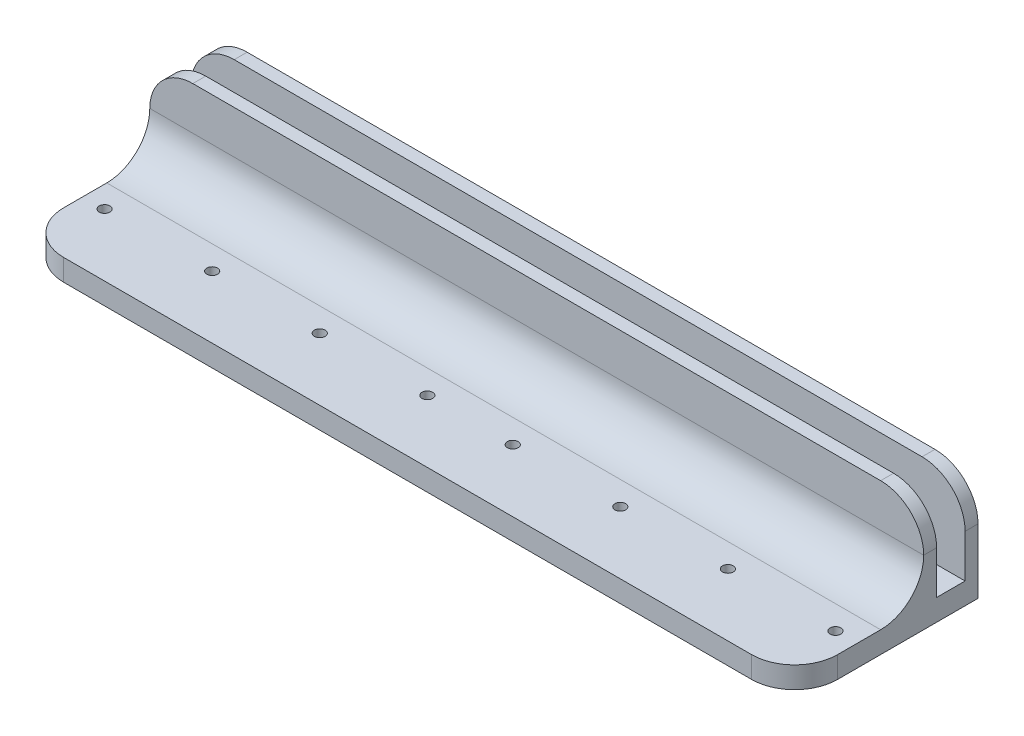
ISO-10303-21;
HEADER;
FILE_DESCRIPTION(('STEP AP214'),'2;1');
FILE_NAME('part.step','',(''),(''),'','','');
FILE_SCHEMA(('AUTOMOTIVE_DESIGN { 1 0 10303 214 1 1 1 1 }'));
ENDSEC;
DATA;
#1=APPLICATION_CONTEXT('core data for automotive mechanical design processes');
#2=APPLICATION_PROTOCOL_DEFINITION('international standard','automotive_design',2000,#1);
#3=PRODUCT_CONTEXT('',#1,'mechanical');
#4=PRODUCT('Part','Part','',(#3));
#5=PRODUCT_RELATED_PRODUCT_CATEGORY('part','',(#4));
#6=PRODUCT_DEFINITION_FORMATION('','',#4);
#7=PRODUCT_DEFINITION_CONTEXT('part definition',#1,'design');
#8=PRODUCT_DEFINITION('design','',#6,#7);
#9=PRODUCT_DEFINITION_SHAPE('','',#8);
#10=(LENGTH_UNIT() NAMED_UNIT(*) SI_UNIT(.MILLI.,.METRE.));
#11=(NAMED_UNIT(*) PLANE_ANGLE_UNIT() SI_UNIT($,.RADIAN.));
#12=(NAMED_UNIT(*) SI_UNIT($,.STERADIAN.) SOLID_ANGLE_UNIT());
#13=UNCERTAINTY_MEASURE_WITH_UNIT(LENGTH_MEASURE(1.E-05),#10,'distance_accuracy_value','');
#14=(GEOMETRIC_REPRESENTATION_CONTEXT(3) GLOBAL_UNCERTAINTY_ASSIGNED_CONTEXT((#13)) GLOBAL_UNIT_ASSIGNED_CONTEXT((#10,
#11,#12)) REPRESENTATION_CONTEXT('',''));
#15=CARTESIAN_POINT('',(0.,0.,0.));
#16=DIRECTION('',(0.,0.,1.));
#17=DIRECTION('',(1.,0.,0.));
#18=AXIS2_PLACEMENT_3D('',#15,#16,#17);
#19=CARTESIAN_POINT('',(0.,5.,0.));
#20=DIRECTION('',(0.,1.,0.));
#21=DIRECTION('',(0.,0.,1.));
#22=AXIS2_PLACEMENT_3D('',#19,#20,#21);
#23=PLANE('',#22);
#24=CARTESIAN_POINT('',(93.9288888888889,5.,2.97202653910937));
#25=DIRECTION('',(0.,1.,0.));
#26=DIRECTION('',(0.,0.,1.));
#27=AXIS2_PLACEMENT_3D('',#24,#25,#26);
#28=CIRCLE('',#27,1.25);
#29=CARTESIAN_POINT('',(93.9288888888889,5.,4.22202653910937));
#30=VERTEX_POINT('',#29);
#31=EDGE_CURVE('E229',#30,#30,#28,.T.);
#32=ORIENTED_EDGE('',*,*,#31,.F.);
#33=EDGE_LOOP('',(#32));
#34=FACE_BOUND('',#33,.T.);
#35=CARTESIAN_POINT('',(68.9288888888889,5.,2.97202653910937));
#36=DIRECTION('',(0.,1.,0.));
#37=DIRECTION('',(0.,0.,1.));
#38=AXIS2_PLACEMENT_3D('',#35,#36,#37);
#39=CIRCLE('',#38,1.25);
#40=CARTESIAN_POINT('',(68.9288888888889,5.,4.22202653910937));
#41=VERTEX_POINT('',#40);
#42=EDGE_CURVE('E233',#41,#41,#39,.T.);
#43=ORIENTED_EDGE('',*,*,#42,.F.);
#44=EDGE_LOOP('',(#43));
#45=FACE_BOUND('',#44,.T.);
#46=CARTESIAN_POINT('',(43.9288888888889,5.,2.97202653910937));
#47=DIRECTION('',(0.,1.,0.));
#48=DIRECTION('',(0.,0.,1.));
#49=AXIS2_PLACEMENT_3D('',#46,#47,#48);
#50=CIRCLE('',#49,1.25);
#51=CARTESIAN_POINT('',(43.9288888888889,5.,4.22202653910937));
#52=VERTEX_POINT('',#51);
#53=EDGE_CURVE('E237',#52,#52,#50,.T.);
#54=ORIENTED_EDGE('',*,*,#53,.F.);
#55=EDGE_LOOP('',(#54));
#56=FACE_BOUND('',#55,.T.);
#57=CARTESIAN_POINT('',(18.9288888888889,5.,2.97202653910937));
#58=DIRECTION('',(0.,1.,0.));
#59=DIRECTION('',(0.,0.,1.));
#60=AXIS2_PLACEMENT_3D('',#57,#58,#59);
#61=CIRCLE('',#60,1.25);
#62=CARTESIAN_POINT('',(18.9288888888889,5.,4.22202653910937));
#63=VERTEX_POINT('',#62);
#64=EDGE_CURVE('E241',#63,#63,#61,.T.);
#65=ORIENTED_EDGE('',*,*,#64,.F.);
#66=EDGE_LOOP('',(#65));
#67=FACE_BOUND('',#66,.T.);
#68=CARTESIAN_POINT('',(-0.911111111111064,5.,2.97202653910937));
#69=DIRECTION('',(0.,1.,0.));
#70=DIRECTION('',(0.,0.,1.));
#71=AXIS2_PLACEMENT_3D('',#68,#69,#70);
#72=CIRCLE('',#71,1.25);
#73=CARTESIAN_POINT('',(-0.911111111111064,5.,4.22202653910937));
#74=VERTEX_POINT('',#73);
#75=EDGE_CURVE('E245',#74,#74,#72,.T.);
#76=ORIENTED_EDGE('',*,*,#75,.F.);
#77=EDGE_LOOP('',(#76));
#78=FACE_BOUND('',#77,.T.);
#79=CARTESIAN_POINT('',(-25.9111111111111,5.,2.97202653910937));
#80=DIRECTION('',(0.,1.,0.));
#81=DIRECTION('',(0.,0.,1.));
#82=AXIS2_PLACEMENT_3D('',#79,#80,#81);
#83=CIRCLE('',#82,1.25);
#84=CARTESIAN_POINT('',(-25.9111111111111,5.,4.22202653910937));
#85=VERTEX_POINT('',#84);
#86=EDGE_CURVE('E249',#85,#85,#83,.T.);
#87=ORIENTED_EDGE('',*,*,#86,.F.);
#88=EDGE_LOOP('',(#87));
#89=FACE_BOUND('',#88,.T.);
#90=CARTESIAN_POINT('',(-50.9111111111111,5.,2.97202653910937));
#91=DIRECTION('',(0.,1.,0.));
#92=DIRECTION('',(0.,0.,1.));
#93=AXIS2_PLACEMENT_3D('',#90,#91,#92);
#94=CIRCLE('',#93,1.25);
#95=CARTESIAN_POINT('',(-50.9111111111111,5.,4.22202653910937));
#96=VERTEX_POINT('',#95);
#97=EDGE_CURVE('E253',#96,#96,#94,.T.);
#98=ORIENTED_EDGE('',*,*,#97,.F.);
#99=EDGE_LOOP('',(#98));
#100=FACE_BOUND('',#99,.T.);
#101=CARTESIAN_POINT('',(-75.9111111111111,5.,2.97202653910937));
#102=DIRECTION('',(0.,1.,0.));
#103=DIRECTION('',(0.,0.,1.));
#104=AXIS2_PLACEMENT_3D('',#101,#102,#103);
#105=CIRCLE('',#104,1.25);
#106=CARTESIAN_POINT('',(-75.9111111111111,5.,4.22202653910937));
#107=VERTEX_POINT('',#106);
#108=EDGE_CURVE('E257',#107,#107,#105,.T.);
#109=ORIENTED_EDGE('',*,*,#108,.F.);
#110=EDGE_LOOP('',(#109));
#111=FACE_BOUND('',#110,.T.);
#112=DIRECTION('',(0.,0.,1.));
#113=VECTOR('',#112,1.);
#114=CARTESIAN_POINT('',(98.9288888888889,5.,0.));
#115=LINE('',#114,#113);
#116=CARTESIAN_POINT('',(98.9288888888889,5.,-2.52797346089063));
#117=VERTEX_POINT('',#116);
#118=CARTESIAN_POINT('',(98.9288888888889,5.,7.4720265391093));
#119=VERTEX_POINT('',#118);
#120=EDGE_CURVE('E184',#117,#119,#115,.T.);
#121=ORIENTED_EDGE('',*,*,#120,.F.);
#122=DIRECTION('',(-1.,0.,0.));
#123=VECTOR('',#122,1.);
#124=CARTESIAN_POINT('',(-80.9111111111111,5.,-2.52797346089063));
#125=LINE('',#124,#123);
#126=CARTESIAN_POINT('',(-80.9111111111111,5.,-2.52797346089063));
#127=VERTEX_POINT('',#126);
#128=EDGE_CURVE('E333',#117,#127,#125,.T.);
#129=ORIENTED_EDGE('',*,*,#128,.T.);
#130=DIRECTION('',(0.,0.,1.));
#131=VECTOR('',#130,1.);
#132=CARTESIAN_POINT('',(-80.9111111111111,5.,0.));
#133=LINE('',#132,#131);
#134=CARTESIAN_POINT('',(-80.9111111111111,5.,7.4720265391093));
#135=VERTEX_POINT('',#134);
#136=EDGE_CURVE('E183',#127,#135,#133,.T.);
#137=ORIENTED_EDGE('',*,*,#136,.T.);
#138=CARTESIAN_POINT('',(-70.9111111111111,5.,7.47202653910937));
#139=DIRECTION('',(0.,1.,0.));
#140=DIRECTION('',(0.,0.,1.));
#141=AXIS2_PLACEMENT_3D('',#138,#139,#140);
#142=CIRCLE('',#141,10.);
#143=CARTESIAN_POINT('',(-70.911111111111,5.,17.4720265391094));
#144=VERTEX_POINT('',#143);
#145=EDGE_CURVE('E214',#144,#135,#142,.F.);
#146=ORIENTED_EDGE('',*,*,#145,.F.);
#147=DIRECTION('',(1.,0.,0.));
#148=VECTOR('',#147,1.);
#149=CARTESIAN_POINT('',(0.,5.,17.4720265391094));
#150=LINE('',#149,#148);
#151=CARTESIAN_POINT('',(88.9288888888889,5.,17.4720265391094));
#152=VERTEX_POINT('',#151);
#153=EDGE_CURVE('E218',#144,#152,#150,.T.);
#154=ORIENTED_EDGE('',*,*,#153,.T.);
#155=CARTESIAN_POINT('',(88.9288888888889,5.,7.47202653910937));
#156=DIRECTION('',(0.,1.,0.));
#157=DIRECTION('',(0.,0.,1.));
#158=AXIS2_PLACEMENT_3D('',#155,#156,#157);
#159=CIRCLE('',#158,10.);
#160=EDGE_CURVE('E222',#119,#152,#159,.F.);
#161=ORIENTED_EDGE('',*,*,#160,.F.);
#162=EDGE_LOOP('',(#121,#129,#137,#146,#154,#161));
#163=FACE_BOUND('',#162,.T.);
#164=ADVANCED_FACE('F43',(#34,#45,#56,#67,#78,#89,#100,#111,#163),#23,.T.);
#165=CARTESIAN_POINT('',(-70.9111111111111,5.,7.47202653910937));
#166=DIRECTION('',(0.,-1.,0.));
#167=DIRECTION('',(0.,0.,-1.));
#168=AXIS2_PLACEMENT_3D('',#165,#166,#167);
#169=CYLINDRICAL_SURFACE('',#168,10.);
#170=CARTESIAN_POINT('',(-70.9111111111111,0.,7.47202653910937));
#171=DIRECTION('',(0.,1.,0.));
#172=DIRECTION('',(0.,0.,1.));
#173=AXIS2_PLACEMENT_3D('',#170,#171,#172);
#174=CIRCLE('',#173,10.);
#175=CARTESIAN_POINT('',(-70.911111111111,0.,17.4720265391094));
#176=VERTEX_POINT('',#175);
#177=CARTESIAN_POINT('',(-80.9111111111111,0.,7.4720265391093));
#178=VERTEX_POINT('',#177);
#179=EDGE_CURVE('E213',#176,#178,#174,.F.);
#180=ORIENTED_EDGE('',*,*,#179,.F.);
#181=DIRECTION('',(0.,-1.,0.));
#182=VECTOR('',#181,1.);
#183=CARTESIAN_POINT('',(-70.911111111111,5.,17.4720265391094));
#184=LINE('',#183,#182);
#185=EDGE_CURVE('E330',#144,#176,#184,.T.);
#186=ORIENTED_EDGE('',*,*,#185,.F.);
#187=ORIENTED_EDGE('',*,*,#145,.T.);
#188=DIRECTION('',(0.,-1.,0.));
#189=VECTOR('',#188,1.);
#190=CARTESIAN_POINT('',(-80.9111111111111,5.,7.4720265391093));
#191=LINE('',#190,#189);
#192=EDGE_CURVE('E261',#135,#178,#191,.T.);
#193=ORIENTED_EDGE('',*,*,#192,.T.);
#194=EDGE_LOOP('',(#180,#186,#187,#193));
#195=FACE_BOUND('',#194,.T.);
#196=ADVANCED_FACE('F420',(#195),#169,.T.);
#197=CARTESIAN_POINT('',(0.,5.,17.4720265391094));
#198=DIRECTION('',(0.,0.,-1.));
#199=DIRECTION('',(-1.,0.,0.));
#200=AXIS2_PLACEMENT_3D('',#197,#198,#199);
#201=PLANE('',#200);
#202=DIRECTION('',(1.,0.,0.));
#203=VECTOR('',#202,1.);
#204=CARTESIAN_POINT('',(0.,0.,17.4720265391094));
#205=LINE('',#204,#203);
#206=CARTESIAN_POINT('',(88.9288888888889,0.,17.4720265391094));
#207=VERTEX_POINT('',#206);
#208=EDGE_CURVE('E265',#176,#207,#205,.T.);
#209=ORIENTED_EDGE('',*,*,#208,.T.);
#210=DIRECTION('',(0.,-1.,0.));
#211=VECTOR('',#210,1.);
#212=CARTESIAN_POINT('',(88.9288888888889,5.,17.4720265391094));
#213=LINE('',#212,#211);
#214=EDGE_CURVE('E327',#152,#207,#213,.T.);
#215=ORIENTED_EDGE('',*,*,#214,.F.);
#216=ORIENTED_EDGE('',*,*,#153,.F.);
#217=ORIENTED_EDGE('',*,*,#185,.T.);
#218=EDGE_LOOP('',(#209,#215,#216,#217));
#219=FACE_BOUND('',#218,.T.);
#220=ADVANCED_FACE('F458',(#219),#201,.F.);
#221=CARTESIAN_POINT('',(88.9288888888889,5.,7.47202653910937));
#222=DIRECTION('',(0.,-1.,0.));
#223=DIRECTION('',(0.,0.,-1.));
#224=AXIS2_PLACEMENT_3D('',#221,#222,#223);
#225=CYLINDRICAL_SURFACE('',#224,10.);
#226=CARTESIAN_POINT('',(88.9288888888889,0.,7.47202653910937));
#227=DIRECTION('',(0.,1.,0.));
#228=DIRECTION('',(0.,0.,1.));
#229=AXIS2_PLACEMENT_3D('',#226,#227,#228);
#230=CIRCLE('',#229,10.);
#231=CARTESIAN_POINT('',(98.9288888888889,0.,7.4720265391093));
#232=VERTEX_POINT('',#231);
#233=EDGE_CURVE('E269',#232,#207,#230,.F.);
#234=ORIENTED_EDGE('',*,*,#233,.F.);
#235=DIRECTION('',(0.,-1.,0.));
#236=VECTOR('',#235,1.);
#237=CARTESIAN_POINT('',(98.9288888888889,5.,7.4720265391093));
#238=LINE('',#237,#236);
#239=EDGE_CURVE('E324',#119,#232,#238,.T.);
#240=ORIENTED_EDGE('',*,*,#239,.F.);
#241=ORIENTED_EDGE('',*,*,#160,.T.);
#242=ORIENTED_EDGE('',*,*,#214,.T.);
#243=EDGE_LOOP('',(#234,#240,#241,#242));
#244=FACE_BOUND('',#243,.T.);
#245=ADVANCED_FACE('F510',(#244),#225,.T.);
#246=CARTESIAN_POINT('',(98.9288888888889,5.,0.));
#247=DIRECTION('',(1.,0.,0.));
#248=DIRECTION('',(0.,0.,-1.));
#249=AXIS2_PLACEMENT_3D('',#246,#247,#248);
#250=PLANE('',#249);
#251=DIRECTION('',(0.,-1.,0.));
#252=VECTOR('',#251,1.);
#253=CARTESIAN_POINT('',(98.9288888888889,25.,-15.5279734608906));
#254=LINE('',#253,#252);
#255=CARTESIAN_POINT('',(98.9288888888889,15.,-15.5279734608906));
#256=VERTEX_POINT('',#255);
#257=CARTESIAN_POINT('',(98.9288888888889,5.,-15.5279734608906));
#258=VERTEX_POINT('',#257);
#259=EDGE_CURVE('E210',#256,#258,#254,.T.);
#260=ORIENTED_EDGE('',*,*,#259,.F.);
#261=DIRECTION('',(0.,0.,-1.));
#262=VECTOR('',#261,1.);
#263=CARTESIAN_POINT('',(98.9288888888889,15.,0.));
#264=LINE('',#263,#262);
#265=CARTESIAN_POINT('',(98.9288888888889,15.,-12.5279734608906));
#266=VERTEX_POINT('',#265);
#267=EDGE_CURVE('E11',#256,#266,#264,.F.);
#268=ORIENTED_EDGE('',*,*,#267,.T.);
#269=CARTESIAN_POINT('',(98.9288888888889,15.,-2.52797346089063));
#270=DIRECTION('',(1.,0.,0.));
#271=DIRECTION('',(0.,0.,-1.));
#272=AXIS2_PLACEMENT_3D('',#269,#270,#271);
#273=CIRCLE('',#272,10.);
#274=EDGE_CURVE('E344',#266,#117,#273,.F.);
#275=ORIENTED_EDGE('',*,*,#274,.T.);
#276=ORIENTED_EDGE('',*,*,#120,.T.);
#277=ORIENTED_EDGE('',*,*,#239,.T.);
#278=DIRECTION('',(0.,0.,1.));
#279=VECTOR('',#278,1.);
#280=CARTESIAN_POINT('',(98.9288888888889,0.,0.));
#281=LINE('',#280,#279);
#282=CARTESIAN_POINT('',(98.9288888888889,0.,-25.1479734608906));
#283=VERTEX_POINT('',#282);
#284=EDGE_CURVE('E273',#283,#232,#281,.T.);
#285=ORIENTED_EDGE('',*,*,#284,.F.);
#286=DIRECTION('',(0.,-1.,0.));
#287=VECTOR('',#286,1.);
#288=CARTESIAN_POINT('',(98.9288888888889,5.,-25.1479734608906));
#289=LINE('',#288,#287);
#290=CARTESIAN_POINT('',(98.9288888888889,15.,-25.1479734608906));
#291=VERTEX_POINT('',#290);
#292=EDGE_CURVE('E321',#291,#283,#289,.T.);
#293=ORIENTED_EDGE('',*,*,#292,.F.);
#294=DIRECTION('',(0.,0.,-1.));
#295=VECTOR('',#294,1.);
#296=CARTESIAN_POINT('',(98.9288888888889,15.,0.));
#297=LINE('',#296,#295);
#298=CARTESIAN_POINT('',(98.9288888888889,15.,-22.1479734608906));
#299=VERTEX_POINT('',#298);
#300=EDGE_CURVE('E52',#291,#299,#297,.F.);
#301=ORIENTED_EDGE('',*,*,#300,.T.);
#302=DIRECTION('',(0.,-1.,0.));
#303=VECTOR('',#302,1.);
#304=CARTESIAN_POINT('',(98.9288888888889,25.,-22.1479734608906));
#305=LINE('',#304,#303);
#306=CARTESIAN_POINT('',(98.9288888888889,5.,-22.1479734608906));
#307=VERTEX_POINT('',#306);
#308=EDGE_CURVE('E159',#299,#307,#305,.T.);
#309=ORIENTED_EDGE('',*,*,#308,.T.);
#310=EDGE_CURVE('E163',#307,#258,#115,.T.);
#311=ORIENTED_EDGE('',*,*,#310,.T.);
#312=EDGE_LOOP('',(#260,#268,#275,#276,#277,#285,#293,#301,#309,#311));
#313=FACE_BOUND('',#312,.T.);
#314=ADVANCED_FACE('F162',(#313),#250,.T.);
#315=CARTESIAN_POINT('',(0.,5.,-25.1479734608906));
#316=DIRECTION('',(0.,0.,-1.));
#317=DIRECTION('',(-1.,0.,0.));
#318=AXIS2_PLACEMENT_3D('',#315,#316,#317);
#319=PLANE('',#318);
#320=DIRECTION('',(0.,-1.,0.));
#321=VECTOR('',#320,1.);
#322=CARTESIAN_POINT('',(-80.9111111111111,5.,-25.1479734608906));
#323=LINE('',#322,#321);
#324=CARTESIAN_POINT('',(-80.9111111111111,15.,-25.1479734608906));
#325=VERTEX_POINT('',#324);
#326=CARTESIAN_POINT('',(-80.9111111111111,0.,-25.1479734608906));
#327=VERTEX_POINT('',#326);
#328=EDGE_CURVE('E318',#325,#327,#323,.T.);
#329=ORIENTED_EDGE('',*,*,#328,.F.);
#330=CARTESIAN_POINT('',(-70.9111111111111,15.,-25.1479734608906));
#331=DIRECTION('',(0.,0.,-1.));
#332=DIRECTION('',(-1.,0.,0.));
#333=AXIS2_PLACEMENT_3D('',#330,#331,#332);
#334=CIRCLE('',#333,10.);
#335=CARTESIAN_POINT('',(-70.9111111111111,25.,-25.1479734608906));
#336=VERTEX_POINT('',#335);
#337=EDGE_CURVE('E358',#325,#336,#334,.T.);
#338=ORIENTED_EDGE('',*,*,#337,.T.);
#339=DIRECTION('',(-1.,0.,0.));
#340=VECTOR('',#339,1.);
#341=CARTESIAN_POINT('',(0.,25.,-25.1479734608906));
#342=LINE('',#341,#340);
#343=CARTESIAN_POINT('',(88.9288888888889,25.,-25.1479734608906));
#344=VERTEX_POINT('',#343);
#345=EDGE_CURVE('E190',#344,#336,#342,.T.);
#346=ORIENTED_EDGE('',*,*,#345,.F.);
#347=CARTESIAN_POINT('',(88.9288888888889,15.,-25.1479734608906));
#348=DIRECTION('',(0.,0.,-1.));
#349=DIRECTION('',(-1.,0.,0.));
#350=AXIS2_PLACEMENT_3D('',#347,#348,#349);
#351=CIRCLE('',#350,10.);
#352=EDGE_CURVE('E355',#344,#291,#351,.T.);
#353=ORIENTED_EDGE('',*,*,#352,.T.);
#354=ORIENTED_EDGE('',*,*,#292,.T.);
#355=DIRECTION('',(1.,0.,0.));
#356=VECTOR('',#355,1.);
#357=CARTESIAN_POINT('',(0.,0.,-25.1479734608906));
#358=LINE('',#357,#356);
#359=EDGE_CURVE('E277',#327,#283,#358,.T.);
#360=ORIENTED_EDGE('',*,*,#359,.F.);
#361=EDGE_LOOP('',(#329,#338,#346,#353,#354,#360));
#362=FACE_BOUND('',#361,.T.);
#363=ADVANCED_FACE('F408',(#362),#319,.T.);
#364=CARTESIAN_POINT('',(-50.9111111111111,5.,2.97202653910937));
#365=DIRECTION('',(0.,-1.,0.));
#366=DIRECTION('',(0.,0.,-1.));
#367=AXIS2_PLACEMENT_3D('',#364,#365,#366);
#368=CYLINDRICAL_SURFACE('',#367,1.25);
#369=ORIENTED_EDGE('',*,*,#97,.T.);
#370=EDGE_LOOP('',(#369));
#371=FACE_BOUND('',#370,.T.);
#372=CARTESIAN_POINT('',(-50.9111111111111,0.,2.97202653910937));
#373=DIRECTION('',(0.,1.,0.));
#374=DIRECTION('',(0.,0.,1.));
#375=AXIS2_PLACEMENT_3D('',#372,#373,#374);
#376=CIRCLE('',#375,1.25);
#377=CARTESIAN_POINT('',(-50.9111111111111,0.,4.22202653910937));
#378=VERTEX_POINT('',#377);
#379=EDGE_CURVE('E309',#378,#378,#376,.T.);
#380=ORIENTED_EDGE('',*,*,#379,.F.);
#381=EDGE_LOOP('',(#380));
#382=FACE_BOUND('',#381,.T.);
#383=ADVANCED_FACE('F479',(#371,#382),#368,.F.);
#384=CARTESIAN_POINT('',(-25.9111111111111,5.,2.97202653910937));
#385=DIRECTION('',(0.,-1.,0.));
#386=DIRECTION('',(0.,0.,-1.));
#387=AXIS2_PLACEMENT_3D('',#384,#385,#386);
#388=CYLINDRICAL_SURFACE('',#387,1.25);
#389=ORIENTED_EDGE('',*,*,#86,.T.);
#390=EDGE_LOOP('',(#389));
#391=FACE_BOUND('',#390,.T.);
#392=CARTESIAN_POINT('',(-25.9111111111111,0.,2.97202653910937));
#393=DIRECTION('',(0.,1.,0.));
#394=DIRECTION('',(0.,0.,1.));
#395=AXIS2_PLACEMENT_3D('',#392,#393,#394);
#396=CIRCLE('',#395,1.25);
#397=CARTESIAN_POINT('',(-25.9111111111111,0.,4.22202653910937));
#398=VERTEX_POINT('',#397);
#399=EDGE_CURVE('E305',#398,#398,#396,.T.);
#400=ORIENTED_EDGE('',*,*,#399,.F.);
#401=EDGE_LOOP('',(#400));
#402=FACE_BOUND('',#401,.T.);
#403=ADVANCED_FACE('F482',(#391,#402),#388,.F.);
#404=CARTESIAN_POINT('',(-0.911111111111064,5.,2.97202653910937));
#405=DIRECTION('',(0.,-1.,0.));
#406=DIRECTION('',(0.,0.,-1.));
#407=AXIS2_PLACEMENT_3D('',#404,#405,#406);
#408=CYLINDRICAL_SURFACE('',#407,1.25);
#409=ORIENTED_EDGE('',*,*,#75,.T.);
#410=EDGE_LOOP('',(#409));
#411=FACE_BOUND('',#410,.T.);
#412=CARTESIAN_POINT('',(-0.911111111111064,0.,2.97202653910937));
#413=DIRECTION('',(0.,1.,0.));
#414=DIRECTION('',(0.,0.,1.));
#415=AXIS2_PLACEMENT_3D('',#412,#413,#414);
#416=CIRCLE('',#415,1.25);
#417=CARTESIAN_POINT('',(-0.911111111111064,0.,4.22202653910937));
#418=VERTEX_POINT('',#417);
#419=EDGE_CURVE('E301',#418,#418,#416,.T.);
#420=ORIENTED_EDGE('',*,*,#419,.F.);
#421=EDGE_LOOP('',(#420));
#422=FACE_BOUND('',#421,.T.);
#423=ADVANCED_FACE('F486',(#411,#422),#408,.F.);
#424=CARTESIAN_POINT('',(18.9288888888889,5.,2.97202653910937));
#425=DIRECTION('',(0.,-1.,0.));
#426=DIRECTION('',(0.,0.,-1.));
#427=AXIS2_PLACEMENT_3D('',#424,#425,#426);
#428=CYLINDRICAL_SURFACE('',#427,1.25);
#429=ORIENTED_EDGE('',*,*,#64,.T.);
#430=EDGE_LOOP('',(#429));
#431=FACE_BOUND('',#430,.T.);
#432=CARTESIAN_POINT('',(18.9288888888889,0.,2.97202653910937));
#433=DIRECTION('',(0.,1.,0.));
#434=DIRECTION('',(0.,0.,1.));
#435=AXIS2_PLACEMENT_3D('',#432,#433,#434);
#436=CIRCLE('',#435,1.25);
#437=CARTESIAN_POINT('',(18.9288888888889,0.,4.22202653910937));
#438=VERTEX_POINT('',#437);
#439=EDGE_CURVE('E297',#438,#438,#436,.T.);
#440=ORIENTED_EDGE('',*,*,#439,.F.);
#441=EDGE_LOOP('',(#440));
#442=FACE_BOUND('',#441,.T.);
#443=ADVANCED_FACE('F490',(#431,#442),#428,.F.);
#444=CARTESIAN_POINT('',(43.9288888888889,5.,2.97202653910937));
#445=DIRECTION('',(0.,-1.,0.));
#446=DIRECTION('',(0.,0.,-1.));
#447=AXIS2_PLACEMENT_3D('',#444,#445,#446);
#448=CYLINDRICAL_SURFACE('',#447,1.25);
#449=ORIENTED_EDGE('',*,*,#53,.T.);
#450=EDGE_LOOP('',(#449));
#451=FACE_BOUND('',#450,.T.);
#452=CARTESIAN_POINT('',(43.9288888888889,0.,2.97202653910937));
#453=DIRECTION('',(0.,1.,0.));
#454=DIRECTION('',(0.,0.,1.));
#455=AXIS2_PLACEMENT_3D('',#452,#453,#454);
#456=CIRCLE('',#455,1.25);
#457=CARTESIAN_POINT('',(43.9288888888889,0.,4.22202653910937));
#458=VERTEX_POINT('',#457);
#459=EDGE_CURVE('E293',#458,#458,#456,.T.);
#460=ORIENTED_EDGE('',*,*,#459,.F.);
#461=EDGE_LOOP('',(#460));
#462=FACE_BOUND('',#461,.T.);
#463=ADVANCED_FACE('F494',(#451,#462),#448,.F.);
#464=CARTESIAN_POINT('',(68.9288888888889,5.,2.97202653910937));
#465=DIRECTION('',(0.,-1.,0.));
#466=DIRECTION('',(0.,0.,-1.));
#467=AXIS2_PLACEMENT_3D('',#464,#465,#466);
#468=CYLINDRICAL_SURFACE('',#467,1.25);
#469=ORIENTED_EDGE('',*,*,#42,.T.);
#470=EDGE_LOOP('',(#469));
#471=FACE_BOUND('',#470,.T.);
#472=CARTESIAN_POINT('',(68.9288888888889,0.,2.97202653910937));
#473=DIRECTION('',(0.,1.,0.));
#474=DIRECTION('',(0.,0.,1.));
#475=AXIS2_PLACEMENT_3D('',#472,#473,#474);
#476=CIRCLE('',#475,1.25);
#477=CARTESIAN_POINT('',(68.9288888888889,0.,4.22202653910937));
#478=VERTEX_POINT('',#477);
#479=EDGE_CURVE('E289',#478,#478,#476,.T.);
#480=ORIENTED_EDGE('',*,*,#479,.F.);
#481=EDGE_LOOP('',(#480));
#482=FACE_BOUND('',#481,.T.);
#483=ADVANCED_FACE('F498',(#471,#482),#468,.F.);
#484=CARTESIAN_POINT('',(93.9288888888889,5.,2.97202653910937));
#485=DIRECTION('',(0.,-1.,0.));
#486=DIRECTION('',(0.,0.,-1.));
#487=AXIS2_PLACEMENT_3D('',#484,#485,#486);
#488=CYLINDRICAL_SURFACE('',#487,1.25);
#489=ORIENTED_EDGE('',*,*,#31,.T.);
#490=EDGE_LOOP('',(#489));
#491=FACE_BOUND('',#490,.T.);
#492=CARTESIAN_POINT('',(93.9288888888889,0.,2.97202653910937));
#493=DIRECTION('',(0.,1.,0.));
#494=DIRECTION('',(0.,0.,1.));
#495=AXIS2_PLACEMENT_3D('',#492,#493,#494);
#496=CIRCLE('',#495,1.25);
#497=CARTESIAN_POINT('',(93.9288888888889,0.,4.22202653910937));
#498=VERTEX_POINT('',#497);
#499=EDGE_CURVE('E285',#498,#498,#496,.T.);
#500=ORIENTED_EDGE('',*,*,#499,.F.);
#501=EDGE_LOOP('',(#500));
#502=FACE_BOUND('',#501,.T.);
#503=ADVANCED_FACE('F475',(#491,#502),#488,.F.);
#504=CARTESIAN_POINT('',(-80.9111111111111,5.,0.));
#505=DIRECTION('',(1.,0.,0.));
#506=DIRECTION('',(0.,0.,-1.));
#507=AXIS2_PLACEMENT_3D('',#504,#505,#506);
#508=PLANE('',#507);
#509=DIRECTION('',(0.,-1.,0.));
#510=VECTOR('',#509,1.);
#511=CARTESIAN_POINT('',(-80.9111111111111,25.,-22.1479734608906));
#512=LINE('',#511,#510);
#513=CARTESIAN_POINT('',(-80.9111111111111,15.,-22.1479734608906));
#514=VERTEX_POINT('',#513);
#515=CARTESIAN_POINT('',(-80.9111111111111,5.,-22.1479734608906));
#516=VERTEX_POINT('',#515);
#517=EDGE_CURVE('E171',#514,#516,#512,.T.);
#518=ORIENTED_EDGE('',*,*,#517,.F.);
#519=DIRECTION('',(0.,0.,-1.));
#520=VECTOR('',#519,1.);
#521=CARTESIAN_POINT('',(-80.9111111111111,15.,-25.1479734608906));
#522=LINE('',#521,#520);
#523=EDGE_CURVE('E351',#514,#325,#522,.T.);
#524=ORIENTED_EDGE('',*,*,#523,.T.);
#525=ORIENTED_EDGE('',*,*,#328,.T.);
#526=DIRECTION('',(0.,0.,1.));
#527=VECTOR('',#526,1.);
#528=CARTESIAN_POINT('',(-80.9111111111111,0.,0.));
#529=LINE('',#528,#527);
#530=EDGE_CURVE('E281',#327,#178,#529,.T.);
#531=ORIENTED_EDGE('',*,*,#530,.T.);
#532=ORIENTED_EDGE('',*,*,#192,.F.);
#533=ORIENTED_EDGE('',*,*,#136,.F.);
#534=CARTESIAN_POINT('',(-80.9111111111111,15.,-2.52797346089063));
#535=DIRECTION('',(1.,0.,0.));
#536=DIRECTION('',(0.,0.,-1.));
#537=AXIS2_PLACEMENT_3D('',#534,#535,#536);
#538=CIRCLE('',#537,10.);
#539=CARTESIAN_POINT('',(-80.9111111111111,15.,-12.5279734608906));
#540=VERTEX_POINT('',#539);
#541=EDGE_CURVE('E340',#127,#540,#538,.T.);
#542=ORIENTED_EDGE('',*,*,#541,.T.);
#543=DIRECTION('',(0.,0.,-1.));
#544=VECTOR('',#543,1.);
#545=CARTESIAN_POINT('',(-80.9111111111111,15.,-15.5279734608906));
#546=LINE('',#545,#544);
#547=CARTESIAN_POINT('',(-80.9111111111111,15.,-15.5279734608906));
#548=VERTEX_POINT('',#547);
#549=EDGE_CURVE('E347',#540,#548,#546,.T.);
#550=ORIENTED_EDGE('',*,*,#549,.T.);
#551=DIRECTION('',(0.,-1.,0.));
#552=VECTOR('',#551,1.);
#553=CARTESIAN_POINT('',(-80.9111111111111,25.,-15.5279734608906));
#554=LINE('',#553,#552);
#555=CARTESIAN_POINT('',(-80.9111111111111,5.,-15.5279734608906));
#556=VERTEX_POINT('',#555);
#557=EDGE_CURVE('E205',#548,#556,#554,.T.);
#558=ORIENTED_EDGE('',*,*,#557,.T.);
#559=EDGE_CURVE('E226',#516,#556,#133,.T.);
#560=ORIENTED_EDGE('',*,*,#559,.F.);
#561=EDGE_LOOP('',(#518,#524,#525,#531,#532,#533,#542,#550,#558,#560));
#562=FACE_BOUND('',#561,.T.);
#563=ADVANCED_FACE('F404',(#562),#508,.F.);
#564=CARTESIAN_POINT('',(-75.9111111111111,5.,2.97202653910937));
#565=DIRECTION('',(0.,-1.,0.));
#566=DIRECTION('',(0.,0.,-1.));
#567=AXIS2_PLACEMENT_3D('',#564,#565,#566);
#568=CYLINDRICAL_SURFACE('',#567,1.25);
#569=ORIENTED_EDGE('',*,*,#108,.T.);
#570=EDGE_LOOP('',(#569));
#571=FACE_BOUND('',#570,.T.);
#572=CARTESIAN_POINT('',(-75.9111111111111,0.,2.97202653910937));
#573=DIRECTION('',(0.,1.,0.));
#574=DIRECTION('',(0.,0.,1.));
#575=AXIS2_PLACEMENT_3D('',#572,#573,#574);
#576=CIRCLE('',#575,1.25);
#577=CARTESIAN_POINT('',(-75.9111111111111,0.,4.22202653910937));
#578=VERTEX_POINT('',#577);
#579=EDGE_CURVE('E219',#578,#578,#576,.T.);
#580=ORIENTED_EDGE('',*,*,#579,.F.);
#581=EDGE_LOOP('',(#580));
#582=FACE_BOUND('',#581,.T.);
#583=ADVANCED_FACE('F465',(#571,#582),#568,.F.);
#584=DIRECTION('',(-1.,0.,0.));
#585=VECTOR('',#584,1.);
#586=CARTESIAN_POINT('',(0.,5.,-22.1479734608906));
#587=LINE('',#586,#585);
#588=EDGE_CURVE('E178',#307,#516,#587,.T.);
#589=ORIENTED_EDGE('',*,*,#588,.T.);
#590=ORIENTED_EDGE('',*,*,#559,.T.);
#591=DIRECTION('',(-1.,0.,0.));
#592=VECTOR('',#591,1.);
#593=CARTESIAN_POINT('',(0.,5.,-15.5279734608906));
#594=LINE('',#593,#592);
#595=EDGE_CURVE('E181',#258,#556,#594,.T.);
#596=ORIENTED_EDGE('',*,*,#595,.F.);
#597=ORIENTED_EDGE('',*,*,#310,.F.);
#598=EDGE_LOOP('',(#589,#590,#596,#597));
#599=FACE_BOUND('',#598,.T.);
#600=ADVANCED_FACE('F176',(#599),#23,.T.);
#601=CARTESIAN_POINT('',(0.,0.,0.));
#602=DIRECTION('',(0.,1.,0.));
#603=DIRECTION('',(0.,0.,1.));
#604=AXIS2_PLACEMENT_3D('',#601,#602,#603);
#605=PLANE('',#604);
#606=ORIENTED_EDGE('',*,*,#179,.T.);
#607=ORIENTED_EDGE('',*,*,#530,.F.);
#608=ORIENTED_EDGE('',*,*,#359,.T.);
#609=ORIENTED_EDGE('',*,*,#284,.T.);
#610=ORIENTED_EDGE('',*,*,#233,.T.);
#611=ORIENTED_EDGE('',*,*,#208,.F.);
#612=EDGE_LOOP('',(#606,#607,#608,#609,#610,#611));
#613=FACE_BOUND('',#612,.T.);
#614=ORIENTED_EDGE('',*,*,#499,.T.);
#615=EDGE_LOOP('',(#614));
#616=FACE_BOUND('',#615,.T.);
#617=ORIENTED_EDGE('',*,*,#479,.T.);
#618=EDGE_LOOP('',(#617));
#619=FACE_BOUND('',#618,.T.);
#620=ORIENTED_EDGE('',*,*,#459,.T.);
#621=EDGE_LOOP('',(#620));
#622=FACE_BOUND('',#621,.T.);
#623=ORIENTED_EDGE('',*,*,#439,.T.);
#624=EDGE_LOOP('',(#623));
#625=FACE_BOUND('',#624,.T.);
#626=ORIENTED_EDGE('',*,*,#419,.T.);
#627=EDGE_LOOP('',(#626));
#628=FACE_BOUND('',#627,.T.);
#629=ORIENTED_EDGE('',*,*,#399,.T.);
#630=EDGE_LOOP('',(#629));
#631=FACE_BOUND('',#630,.T.);
#632=ORIENTED_EDGE('',*,*,#379,.T.);
#633=EDGE_LOOP('',(#632));
#634=FACE_BOUND('',#633,.T.);
#635=ORIENTED_EDGE('',*,*,#579,.T.);
#636=EDGE_LOOP('',(#635));
#637=FACE_BOUND('',#636,.T.);
#638=ADVANCED_FACE('F412',(#613,#616,#619,#622,#625,#628,#631,#634,#637),#605,.F.);
#639=CARTESIAN_POINT('',(0.,25.,-15.5279734608906));
#640=DIRECTION('',(0.,0.,1.));
#641=DIRECTION('',(1.,0.,0.));
#642=AXIS2_PLACEMENT_3D('',#639,#640,#641);
#643=PLANE('',#642);
#644=ORIENTED_EDGE('',*,*,#557,.F.);
#645=CARTESIAN_POINT('',(-70.9111111111111,15.,-15.5279734608906));
#646=DIRECTION('',(0.,0.,1.));
#647=DIRECTION('',(1.,0.,0.));
#648=AXIS2_PLACEMENT_3D('',#645,#646,#647);
#649=CIRCLE('',#648,10.);
#650=CARTESIAN_POINT('',(-70.9111111111111,25.,-15.5279734608906));
#651=VERTEX_POINT('',#650);
#652=EDGE_CURVE('E377',#548,#651,#649,.F.);
#653=ORIENTED_EDGE('',*,*,#652,.T.);
#654=DIRECTION('',(-1.,0.,0.));
#655=VECTOR('',#654,1.);
#656=CARTESIAN_POINT('',(0.,25.,-15.5279734608906));
#657=LINE('',#656,#655);
#658=CARTESIAN_POINT('',(88.9288888888889,25.,-15.5279734608906));
#659=VERTEX_POINT('',#658);
#660=EDGE_CURVE('E199',#659,#651,#657,.T.);
#661=ORIENTED_EDGE('',*,*,#660,.F.);
#662=CARTESIAN_POINT('',(88.9288888888889,15.,-15.5279734608906));
#663=DIRECTION('',(0.,0.,1.));
#664=DIRECTION('',(1.,0.,0.));
#665=AXIS2_PLACEMENT_3D('',#662,#663,#664);
#666=CIRCLE('',#665,10.);
#667=EDGE_CURVE('E374',#659,#256,#666,.F.);
#668=ORIENTED_EDGE('',*,*,#667,.T.);
#669=ORIENTED_EDGE('',*,*,#259,.T.);
#670=ORIENTED_EDGE('',*,*,#595,.T.);
#671=EDGE_LOOP('',(#644,#653,#661,#668,#669,#670));
#672=FACE_BOUND('',#671,.T.);
#673=ADVANCED_FACE('F436',(#672),#643,.F.);
#674=CARTESIAN_POINT('',(0.,25.,-12.5279734608906));
#675=DIRECTION('',(0.,0.,1.));
#676=DIRECTION('',(1.,0.,0.));
#677=AXIS2_PLACEMENT_3D('',#674,#675,#676);
#678=PLANE('',#677);
#679=DIRECTION('',(-1.,0.,0.));
#680=VECTOR('',#679,1.);
#681=CARTESIAN_POINT('',(0.,25.,-12.5279734608906));
#682=LINE('',#681,#680);
#683=CARTESIAN_POINT('',(88.9288888888889,25.,-12.5279734608906));
#684=VERTEX_POINT('',#683);
#685=CARTESIAN_POINT('',(-70.9111111111111,25.,-12.5279734608906));
#686=VERTEX_POINT('',#685);
#687=EDGE_CURVE('E202',#684,#686,#682,.T.);
#688=ORIENTED_EDGE('',*,*,#687,.T.);
#689=CARTESIAN_POINT('',(-70.9111111111111,15.,-12.5279734608906));
#690=DIRECTION('',(0.,0.,1.));
#691=DIRECTION('',(1.,0.,0.));
#692=AXIS2_PLACEMENT_3D('',#689,#690,#691);
#693=CIRCLE('',#692,10.);
#694=EDGE_CURVE('E388',#686,#540,#693,.T.);
#695=ORIENTED_EDGE('',*,*,#694,.T.);
#696=DIRECTION('',(-1.,0.,0.));
#697=VECTOR('',#696,1.);
#698=CARTESIAN_POINT('',(98.9288888888889,15.,-12.5279734608906));
#699=LINE('',#698,#697);
#700=EDGE_CURVE('E337',#540,#266,#699,.F.);
#701=ORIENTED_EDGE('',*,*,#700,.T.);
#702=CARTESIAN_POINT('',(88.9288888888889,15.,-12.5279734608906));
#703=DIRECTION('',(0.,0.,1.));
#704=DIRECTION('',(1.,0.,0.));
#705=AXIS2_PLACEMENT_3D('',#702,#703,#704);
#706=CIRCLE('',#705,10.);
#707=EDGE_CURVE('E66',#266,#684,#706,.T.);
#708=ORIENTED_EDGE('',*,*,#707,.T.);
#709=EDGE_LOOP('',(#688,#695,#701,#708));
#710=FACE_BOUND('',#709,.T.);
#711=ADVANCED_FACE('F443',(#710),#678,.T.);
#712=CARTESIAN_POINT('',(0.,25.,0.));
#713=DIRECTION('',(0.,1.,0.));
#714=DIRECTION('',(0.,0.,1.));
#715=AXIS2_PLACEMENT_3D('',#712,#713,#714);
#716=PLANE('',#715);
#717=ORIENTED_EDGE('',*,*,#660,.T.);
#718=DIRECTION('',(0.,0.,-1.));
#719=VECTOR('',#718,1.);
#720=CARTESIAN_POINT('',(-70.9111111111111,25.,-12.5279734608906));
#721=LINE('',#720,#719);
#722=EDGE_CURVE('E59',#651,#686,#721,.F.);
#723=ORIENTED_EDGE('',*,*,#722,.T.);
#724=ORIENTED_EDGE('',*,*,#687,.F.);
#725=DIRECTION('',(0.,0.,-1.));
#726=VECTOR('',#725,1.);
#727=CARTESIAN_POINT('',(88.9288888888889,25.,0.));
#728=LINE('',#727,#726);
#729=EDGE_CURVE('E380',#684,#659,#728,.T.);
#730=ORIENTED_EDGE('',*,*,#729,.T.);
#731=EDGE_LOOP('',(#717,#723,#724,#730));
#732=FACE_BOUND('',#731,.T.);
#733=ADVANCED_FACE('F442',(#732),#716,.T.);
#734=CARTESIAN_POINT('',(0.,25.,-22.1479734608906));
#735=DIRECTION('',(0.,0.,1.));
#736=DIRECTION('',(1.,0.,0.));
#737=AXIS2_PLACEMENT_3D('',#734,#735,#736);
#738=PLANE('',#737);
#739=DIRECTION('',(-1.,0.,0.));
#740=VECTOR('',#739,1.);
#741=CARTESIAN_POINT('',(0.,25.,-22.1479734608906));
#742=LINE('',#741,#740);
#743=CARTESIAN_POINT('',(88.9288888888889,25.,-22.1479734608906));
#744=VERTEX_POINT('',#743);
#745=CARTESIAN_POINT('',(-70.9111111111111,25.,-22.1479734608906));
#746=VERTEX_POINT('',#745);
#747=EDGE_CURVE('E172',#744,#746,#742,.T.);
#748=ORIENTED_EDGE('',*,*,#747,.T.);
#749=CARTESIAN_POINT('',(-70.9111111111111,15.,-22.1479734608906));
#750=DIRECTION('',(0.,0.,1.));
#751=DIRECTION('',(1.,0.,0.));
#752=AXIS2_PLACEMENT_3D('',#749,#750,#751);
#753=CIRCLE('',#752,10.);
#754=EDGE_CURVE('E371',#746,#514,#753,.T.);
#755=ORIENTED_EDGE('',*,*,#754,.T.);
#756=ORIENTED_EDGE('',*,*,#517,.T.);
#757=ORIENTED_EDGE('',*,*,#588,.F.);
#758=ORIENTED_EDGE('',*,*,#308,.F.);
#759=CARTESIAN_POINT('',(88.9288888888889,15.,-22.1479734608906));
#760=DIRECTION('',(0.,0.,1.));
#761=DIRECTION('',(1.,0.,0.));
#762=AXIS2_PLACEMENT_3D('',#759,#760,#761);
#763=CIRCLE('',#762,10.);
#764=EDGE_CURVE('E368',#299,#744,#763,.T.);
#765=ORIENTED_EDGE('',*,*,#764,.T.);
#766=EDGE_LOOP('',(#748,#755,#756,#757,#758,#765));
#767=FACE_BOUND('',#766,.T.);
#768=ADVANCED_FACE('F187',(#767),#738,.T.);
#769=CARTESIAN_POINT('',(0.,25.,0.));
#770=DIRECTION('',(0.,1.,0.));
#771=DIRECTION('',(0.,0.,1.));
#772=AXIS2_PLACEMENT_3D('',#769,#770,#771);
#773=PLANE('',#772);
#774=ORIENTED_EDGE('',*,*,#345,.T.);
#775=DIRECTION('',(0.,0.,-1.));
#776=VECTOR('',#775,1.);
#777=CARTESIAN_POINT('',(-70.9111111111111,25.,-22.1479734608906));
#778=LINE('',#777,#776);
#779=EDGE_CURVE('E365',#336,#746,#778,.F.);
#780=ORIENTED_EDGE('',*,*,#779,.T.);
#781=ORIENTED_EDGE('',*,*,#747,.F.);
#782=DIRECTION('',(0.,0.,-1.));
#783=VECTOR('',#782,1.);
#784=CARTESIAN_POINT('',(88.9288888888889,25.,0.));
#785=LINE('',#784,#783);
#786=EDGE_CURVE('E361',#744,#344,#785,.T.);
#787=ORIENTED_EDGE('',*,*,#786,.T.);
#788=EDGE_LOOP('',(#774,#780,#781,#787));
#789=FACE_BOUND('',#788,.T.);
#790=ADVANCED_FACE('F518',(#789),#773,.T.);
#791=CARTESIAN_POINT('',(0.,15.,-2.52797346089063));
#792=DIRECTION('',(1.,0.,0.));
#793=DIRECTION('',(0.,0.,-1.));
#794=AXIS2_PLACEMENT_3D('',#791,#792,#793);
#795=CYLINDRICAL_SURFACE('',#794,10.);
#796=ORIENTED_EDGE('',*,*,#274,.F.);
#797=ORIENTED_EDGE('',*,*,#700,.F.);
#798=ORIENTED_EDGE('',*,*,#541,.F.);
#799=ORIENTED_EDGE('',*,*,#128,.F.);
#800=EDGE_LOOP('',(#796,#797,#798,#799));
#801=FACE_BOUND('',#800,.T.);
#802=ADVANCED_FACE('F429',(#801),#795,.F.);
#803=CARTESIAN_POINT('',(-70.9111111111111,15.,0.));
#804=DIRECTION('',(0.,0.,1.));
#805=DIRECTION('',(1.,0.,0.));
#806=AXIS2_PLACEMENT_3D('',#803,#804,#805);
#807=CYLINDRICAL_SURFACE('',#806,10.);
#808=ORIENTED_EDGE('',*,*,#754,.F.);
#809=ORIENTED_EDGE('',*,*,#779,.F.);
#810=ORIENTED_EDGE('',*,*,#337,.F.);
#811=ORIENTED_EDGE('',*,*,#523,.F.);
#812=EDGE_LOOP('',(#808,#809,#810,#811));
#813=FACE_BOUND('',#812,.T.);
#814=ADVANCED_FACE('F401',(#813),#807,.T.);
#815=CARTESIAN_POINT('',(-70.9111111111111,15.,0.));
#816=DIRECTION('',(0.,0.,1.));
#817=DIRECTION('',(1.,0.,0.));
#818=AXIS2_PLACEMENT_3D('',#815,#816,#817);
#819=CYLINDRICAL_SURFACE('',#818,10.);
#820=ORIENTED_EDGE('',*,*,#694,.F.);
#821=ORIENTED_EDGE('',*,*,#722,.F.);
#822=ORIENTED_EDGE('',*,*,#652,.F.);
#823=ORIENTED_EDGE('',*,*,#549,.F.);
#824=EDGE_LOOP('',(#820,#821,#822,#823));
#825=FACE_BOUND('',#824,.T.);
#826=ADVANCED_FACE('F444',(#825),#819,.T.);
#827=CARTESIAN_POINT('',(88.9288888888889,15.,0.));
#828=DIRECTION('',(0.,0.,-1.));
#829=DIRECTION('',(-1.,0.,0.));
#830=AXIS2_PLACEMENT_3D('',#827,#828,#829);
#831=CYLINDRICAL_SURFACE('',#830,10.);
#832=ORIENTED_EDGE('',*,*,#707,.F.);
#833=ORIENTED_EDGE('',*,*,#267,.F.);
#834=ORIENTED_EDGE('',*,*,#667,.F.);
#835=ORIENTED_EDGE('',*,*,#729,.F.);
#836=EDGE_LOOP('',(#832,#833,#834,#835));
#837=FACE_BOUND('',#836,.T.);
#838=ADVANCED_FACE('F440',(#837),#831,.T.);
#839=CARTESIAN_POINT('',(88.9288888888889,15.,0.));
#840=DIRECTION('',(0.,0.,-1.));
#841=DIRECTION('',(-1.,0.,0.));
#842=AXIS2_PLACEMENT_3D('',#839,#840,#841);
#843=CYLINDRICAL_SURFACE('',#842,10.);
#844=ORIENTED_EDGE('',*,*,#764,.F.);
#845=ORIENTED_EDGE('',*,*,#300,.F.);
#846=ORIENTED_EDGE('',*,*,#352,.F.);
#847=ORIENTED_EDGE('',*,*,#786,.F.);
#848=EDGE_LOOP('',(#844,#845,#846,#847));
#849=FACE_BOUND('',#848,.T.);
#850=ADVANCED_FACE('F45',(#849),#843,.T.);
#851=CLOSED_SHELL('',(#164,#196,#220,#245,#314,#363,#383,#403,#423,#443,#463,#483,#503,#563,
#583,#600,#638,#673,#711,#733,#768,#790,#802,#814,#826,#838,#850));
#852=MANIFOLD_SOLID_BREP('B2',#851);
#853=ADVANCED_BREP_SHAPE_REPRESENTATION('',(#18,#852),#14);
#854=SHAPE_DEFINITION_REPRESENTATION(#9,#853);
ENDSEC;
END-ISO-10303-21;
